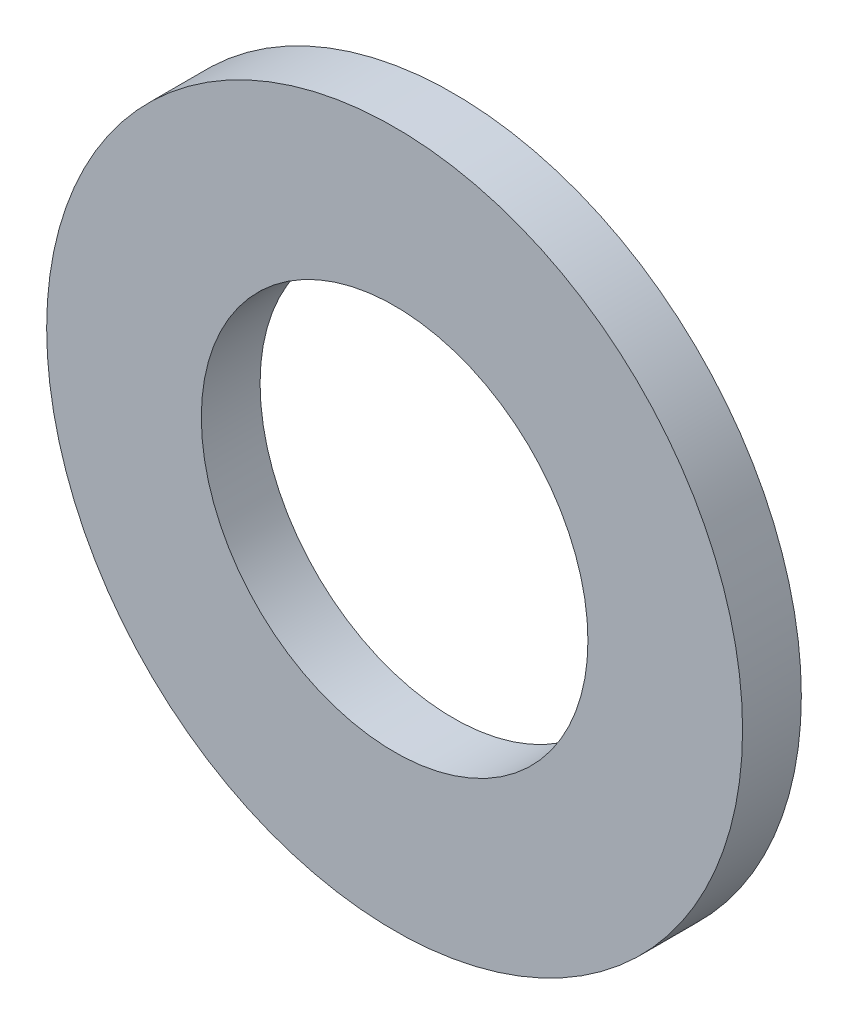
ISO-10303-21;
HEADER;
FILE_DESCRIPTION(('STEP AP214'),'2;1');
FILE_NAME('part.step','',(''),(''),'','','');
FILE_SCHEMA(('AUTOMOTIVE_DESIGN { 1 0 10303 214 1 1 1 1 }'));
ENDSEC;
DATA;
#1=APPLICATION_CONTEXT('core data for automotive mechanical design processes');
#2=APPLICATION_PROTOCOL_DEFINITION('international standard','automotive_design',2000,#1);
#3=PRODUCT_CONTEXT('',#1,'mechanical');
#4=PRODUCT('Part','Part','',(#3));
#5=PRODUCT_RELATED_PRODUCT_CATEGORY('part','',(#4));
#6=PRODUCT_DEFINITION_FORMATION('','',#4);
#7=PRODUCT_DEFINITION_CONTEXT('part definition',#1,'design');
#8=PRODUCT_DEFINITION('design','',#6,#7);
#9=PRODUCT_DEFINITION_SHAPE('','',#8);
#10=(LENGTH_UNIT() NAMED_UNIT(*) SI_UNIT(.MILLI.,.METRE.));
#11=(NAMED_UNIT(*) PLANE_ANGLE_UNIT() SI_UNIT($,.RADIAN.));
#12=(NAMED_UNIT(*) SI_UNIT($,.STERADIAN.) SOLID_ANGLE_UNIT());
#13=UNCERTAINTY_MEASURE_WITH_UNIT(LENGTH_MEASURE(1.E-05),#10,'distance_accuracy_value','');
#14=(GEOMETRIC_REPRESENTATION_CONTEXT(3) GLOBAL_UNCERTAINTY_ASSIGNED_CONTEXT((#13)) GLOBAL_UNIT_ASSIGNED_CONTEXT((#10,
#11,#12)) REPRESENTATION_CONTEXT('',''));
#15=CARTESIAN_POINT('',(0.,0.,0.));
#16=DIRECTION('',(0.,0.,1.));
#17=DIRECTION('',(1.,0.,0.));
#18=AXIS2_PLACEMENT_3D('',#15,#16,#17);
#19=CARTESIAN_POINT('',(0.,0.,-1.2065));
#20=DIRECTION('',(0.,0.,1.));
#21=DIRECTION('',(1.,0.,0.));
#22=AXIS2_PLACEMENT_3D('',#19,#20,#21);
#23=CYLINDRICAL_SURFACE('',#22,14.2875);
#24=CARTESIAN_POINT('',(0.,0.,-1.2065));
#25=DIRECTION('',(0.,0.,1.));
#26=DIRECTION('',(1.,0.,0.));
#27=AXIS2_PLACEMENT_3D('',#24,#25,#26);
#28=CIRCLE('',#27,14.2875);
#29=CARTESIAN_POINT('',(14.2875,0.,-1.2065));
#30=VERTEX_POINT('',#29);
#31=EDGE_CURVE('E10',#30,#30,#28,.T.);
#32=ORIENTED_EDGE('',*,*,#31,.T.);
#33=EDGE_LOOP('',(#32));
#34=FACE_BOUND('',#33,.T.);
#35=CARTESIAN_POINT('',(0.,0.,1.2065));
#36=DIRECTION('',(0.,0.,1.));
#37=DIRECTION('',(1.,0.,0.));
#38=AXIS2_PLACEMENT_3D('',#35,#36,#37);
#39=CIRCLE('',#38,14.2875);
#40=CARTESIAN_POINT('',(14.2875,0.,1.2065));
#41=VERTEX_POINT('',#40);
#42=EDGE_CURVE('E45',#41,#41,#39,.T.);
#43=ORIENTED_EDGE('',*,*,#42,.F.);
#44=EDGE_LOOP('',(#43));
#45=FACE_BOUND('',#44,.T.);
#46=ADVANCED_FACE('F35',(#34,#45),#23,.T.);
#47=CARTESIAN_POINT('',(0.,0.,-1.2065));
#48=DIRECTION('',(0.,0.,1.));
#49=DIRECTION('',(1.,0.,0.));
#50=AXIS2_PLACEMENT_3D('',#47,#48,#49);
#51=PLANE('',#50);
#52=CARTESIAN_POINT('',(0.,0.,-1.2065));
#53=DIRECTION('',(0.,0.,1.));
#54=DIRECTION('',(1.,0.,0.));
#55=AXIS2_PLACEMENT_3D('',#52,#53,#54);
#56=CIRCLE('',#55,7.9375);
#57=CARTESIAN_POINT('',(7.9375,0.,-1.2065));
#58=VERTEX_POINT('',#57);
#59=EDGE_CURVE('E41',#58,#58,#56,.T.);
#60=ORIENTED_EDGE('',*,*,#59,.T.);
#61=EDGE_LOOP('',(#60));
#62=FACE_BOUND('',#61,.T.);
#63=ORIENTED_EDGE('',*,*,#31,.F.);
#64=EDGE_LOOP('',(#63));
#65=FACE_BOUND('',#64,.T.);
#66=ADVANCED_FACE('F64',(#62,#65),#51,.F.);
#67=CARTESIAN_POINT('',(0.,0.,-1.2065));
#68=DIRECTION('',(0.,0.,1.));
#69=DIRECTION('',(1.,0.,0.));
#70=AXIS2_PLACEMENT_3D('',#67,#68,#69);
#71=CYLINDRICAL_SURFACE('',#70,7.9375);
#72=ORIENTED_EDGE('',*,*,#59,.F.);
#73=EDGE_LOOP('',(#72));
#74=FACE_BOUND('',#73,.T.);
#75=CARTESIAN_POINT('',(0.,0.,1.2065));
#76=DIRECTION('',(0.,0.,1.));
#77=DIRECTION('',(1.,0.,0.));
#78=AXIS2_PLACEMENT_3D('',#75,#76,#77);
#79=CIRCLE('',#78,7.9375);
#80=CARTESIAN_POINT('',(7.9375,0.,1.2065));
#81=VERTEX_POINT('',#80);
#82=EDGE_CURVE('E49',#81,#81,#79,.T.);
#83=ORIENTED_EDGE('',*,*,#82,.T.);
#84=EDGE_LOOP('',(#83));
#85=FACE_BOUND('',#84,.T.);
#86=ADVANCED_FACE('F55',(#74,#85),#71,.F.);
#87=CARTESIAN_POINT('',(0.,0.,1.2065));
#88=DIRECTION('',(0.,0.,1.));
#89=DIRECTION('',(1.,0.,0.));
#90=AXIS2_PLACEMENT_3D('',#87,#88,#89);
#91=PLANE('',#90);
#92=ORIENTED_EDGE('',*,*,#42,.T.);
#93=EDGE_LOOP('',(#92));
#94=FACE_BOUND('',#93,.T.);
#95=ORIENTED_EDGE('',*,*,#82,.F.);
#96=EDGE_LOOP('',(#95));
#97=FACE_BOUND('',#96,.T.);
#98=ADVANCED_FACE('F57',(#94,#97),#91,.T.);
#99=CLOSED_SHELL('',(#46,#66,#86,#98));
#100=MANIFOLD_SOLID_BREP('B2',#99);
#101=ADVANCED_BREP_SHAPE_REPRESENTATION('',(#18,#100),#14);
#102=SHAPE_DEFINITION_REPRESENTATION(#9,#101);
ENDSEC;
END-ISO-10303-21;
